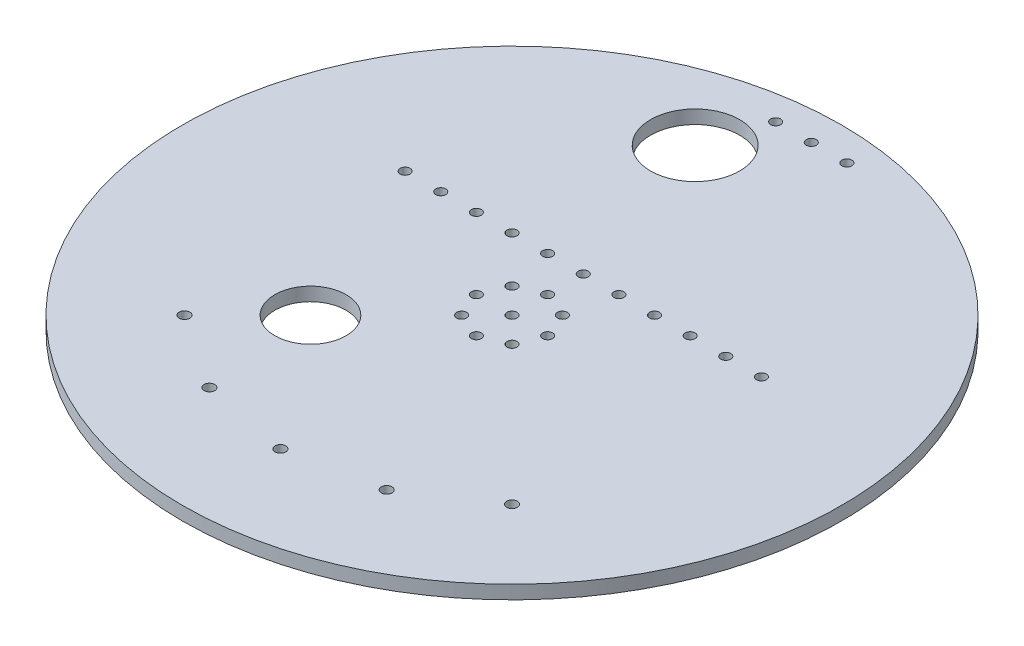
ISO-10303-21;
HEADER;
FILE_DESCRIPTION(('STEP AP214'),'2;1');
FILE_NAME('part.step','',(''),(''),'','','');
FILE_SCHEMA(('AUTOMOTIVE_DESIGN { 1 0 10303 214 1 1 1 1 }'));
ENDSEC;
DATA;
#1=APPLICATION_CONTEXT('core data for automotive mechanical design processes');
#2=APPLICATION_PROTOCOL_DEFINITION('international standard','automotive_design',2000,#1);
#3=PRODUCT_CONTEXT('',#1,'mechanical');
#4=PRODUCT('Part','Part','',(#3));
#5=PRODUCT_RELATED_PRODUCT_CATEGORY('part','',(#4));
#6=PRODUCT_DEFINITION_FORMATION('','',#4);
#7=PRODUCT_DEFINITION_CONTEXT('part definition',#1,'design');
#8=PRODUCT_DEFINITION('design','',#6,#7);
#9=PRODUCT_DEFINITION_SHAPE('','',#8);
#10=(LENGTH_UNIT() NAMED_UNIT(*) SI_UNIT(.MILLI.,.METRE.));
#11=(NAMED_UNIT(*) PLANE_ANGLE_UNIT() SI_UNIT($,.RADIAN.));
#12=(NAMED_UNIT(*) SI_UNIT($,.STERADIAN.) SOLID_ANGLE_UNIT());
#13=UNCERTAINTY_MEASURE_WITH_UNIT(LENGTH_MEASURE(1.E-05),#10,'distance_accuracy_value','');
#14=(GEOMETRIC_REPRESENTATION_CONTEXT(3) GLOBAL_UNCERTAINTY_ASSIGNED_CONTEXT((#13)) GLOBAL_UNIT_ASSIGNED_CONTEXT((#10,
#11,#12)) REPRESENTATION_CONTEXT('',''));
#15=CARTESIAN_POINT('',(0.,0.,0.));
#16=DIRECTION('',(0.,0.,1.));
#17=DIRECTION('',(1.,0.,0.));
#18=AXIS2_PLACEMENT_3D('',#15,#16,#17);
#19=CARTESIAN_POINT('',(0.,-4.826,0.));
#20=DIRECTION('',(0.,1.,0.));
#21=DIRECTION('',(0.,0.,1.));
#22=AXIS2_PLACEMENT_3D('',#19,#20,#21);
#23=CYLINDRICAL_SURFACE('',#22,117.475);
#24=CARTESIAN_POINT('',(0.,-4.826,0.));
#25=DIRECTION('',(0.,1.,0.));
#26=DIRECTION('',(0.,0.,1.));
#27=AXIS2_PLACEMENT_3D('',#24,#25,#26);
#28=CIRCLE('',#27,117.475);
#29=CARTESIAN_POINT('',(0.,-4.826,117.475));
#30=VERTEX_POINT('',#29);
#31=EDGE_CURVE('E10',#30,#30,#28,.T.);
#32=ORIENTED_EDGE('',*,*,#31,.T.);
#33=EDGE_LOOP('',(#32));
#34=FACE_BOUND('',#33,.T.);
#35=CARTESIAN_POINT('',(0.,0.,0.));
#36=DIRECTION('',(0.,1.,0.));
#37=DIRECTION('',(0.,0.,1.));
#38=AXIS2_PLACEMENT_3D('',#35,#36,#37);
#39=CIRCLE('',#38,117.475);
#40=CARTESIAN_POINT('',(0.,0.,117.475));
#41=VERTEX_POINT('',#40);
#42=EDGE_CURVE('E34',#41,#41,#39,.T.);
#43=ORIENTED_EDGE('',*,*,#42,.F.);
#44=EDGE_LOOP('',(#43));
#45=FACE_BOUND('',#44,.T.);
#46=ADVANCED_FACE('F31',(#34,#45),#23,.T.);
#47=CARTESIAN_POINT('',(0.,-4.826,0.));
#48=DIRECTION('',(0.,1.,0.));
#49=DIRECTION('',(0.,0.,1.));
#50=AXIS2_PLACEMENT_3D('',#47,#48,#49);
#51=PLANE('',#50);
#52=CARTESIAN_POINT('',(-19.812,-4.826,-85.09));
#53=DIRECTION('',(0.,1.,0.));
#54=DIRECTION('',(0.,0.,1.));
#55=AXIS2_PLACEMENT_3D('',#52,#53,#54);
#56=CIRCLE('',#55,15.875);
#57=CARTESIAN_POINT('',(-19.812,-4.826,-69.215));
#58=VERTEX_POINT('',#57);
#59=EDGE_CURVE('E214',#58,#58,#56,.T.);
#60=ORIENTED_EDGE('',*,*,#59,.T.);
#61=EDGE_LOOP('',(#60));
#62=FACE_BOUND('',#61,.T.);
#63=CARTESIAN_POINT('',(-58.3716647869496,-4.826,58.3716647869494));
#64=DIRECTION('',(0.,1.,0.));
#65=DIRECTION('',(-0.707106781186549,0.,0.707106781186546));
#66=AXIS2_PLACEMENT_3D('',#63,#64,#65);
#67=CIRCLE('',#66,1.90500000000001);
#68=CARTESIAN_POINT('',(-59.71870320511,-4.826,59.7187032051098));
#69=VERTEX_POINT('',#68);
#70=EDGE_CURVE('E208',#69,#69,#67,.T.);
#71=ORIENTED_EDGE('',*,*,#70,.T.);
#72=EDGE_LOOP('',(#71));
#73=FACE_BOUND('',#72,.T.);
#74=CARTESIAN_POINT('',(-31.5905173417382,-4.826,76.2662554088067));
#75=DIRECTION('',(0.,1.,0.));
#76=DIRECTION('',(-0.382683432365091,0.,0.923879532511287));
#77=AXIS2_PLACEMENT_3D('',#74,#75,#76);
#78=CIRCLE('',#77,1.90500000000001);
#79=CARTESIAN_POINT('',(-32.3195292803937,-4.826,78.0262459182407));
#80=VERTEX_POINT('',#79);
#81=EDGE_CURVE('E202',#80,#80,#78,.T.);
#82=ORIENTED_EDGE('',*,*,#81,.T.);
#83=EDGE_LOOP('',(#82));
#84=FACE_BOUND('',#83,.T.);
#85=CARTESIAN_POINT('',(58.3716647869496,-4.826,58.3716647869494));
#86=DIRECTION('',(0.,1.,0.));
#87=DIRECTION('',(0.707106781186549,0.,0.707106781186546));
#88=AXIS2_PLACEMENT_3D('',#85,#86,#87);
#89=CIRCLE('',#88,1.90500000000001);
#90=CARTESIAN_POINT('',(59.71870320511,-4.826,59.7187032051098));
#91=VERTEX_POINT('',#90);
#92=EDGE_CURVE('E196',#91,#91,#89,.T.);
#93=ORIENTED_EDGE('',*,*,#92,.T.);
#94=EDGE_LOOP('',(#93));
#95=FACE_BOUND('',#94,.T.);
#96=CARTESIAN_POINT('',(31.5905173417382,-4.826,76.2662554088067));
#97=DIRECTION('',(0.,1.,0.));
#98=DIRECTION('',(0.382683432365091,0.,0.923879532511287));
#99=AXIS2_PLACEMENT_3D('',#96,#97,#98);
#100=CIRCLE('',#99,1.90500000000001);
#101=CARTESIAN_POINT('',(32.3195292803937,-4.826,78.0262459182407));
#102=VERTEX_POINT('',#101);
#103=EDGE_CURVE('E190',#102,#102,#100,.T.);
#104=ORIENTED_EDGE('',*,*,#103,.T.);
#105=EDGE_LOOP('',(#104));
#106=FACE_BOUND('',#105,.T.);
#107=CARTESIAN_POINT('',(0.,-4.826,82.55));
#108=DIRECTION('',(0.,1.,0.));
#109=DIRECTION('',(0.,0.,1.));
#110=AXIS2_PLACEMENT_3D('',#107,#108,#109);
#111=CIRCLE('',#110,1.90500000000001);
#112=CARTESIAN_POINT('',(0.,-4.826,84.455));
#113=VERTEX_POINT('',#112);
#114=EDGE_CURVE('E184',#113,#113,#111,.T.);
#115=ORIENTED_EDGE('',*,*,#114,.T.);
#116=EDGE_LOOP('',(#115));
#117=FACE_BOUND('',#116,.T.);
#118=CARTESIAN_POINT('',(-35.9210244842764,-4.826,35.9210244842768));
#119=DIRECTION('',(0.,1.,0.));
#120=DIRECTION('',(0.,0.,1.));
#121=AXIS2_PLACEMENT_3D('',#118,#119,#120);
#122=CIRCLE('',#121,12.7);
#123=CARTESIAN_POINT('',(-35.9210244842764,-4.826,48.6210244842768));
#124=VERTEX_POINT('',#123);
#125=EDGE_CURVE('E178',#124,#124,#122,.T.);
#126=ORIENTED_EDGE('',*,*,#125,.T.);
#127=EDGE_LOOP('',(#126));
#128=FACE_BOUND('',#127,.T.);
#129=CARTESIAN_POINT('',(-8.98025612106917,-4.826,8.98025612106914));
#130=DIRECTION('',(0.,1.,0.));
#131=DIRECTION('',(0.,0.,1.));
#132=AXIS2_PLACEMENT_3D('',#129,#130,#131);
#133=CIRCLE('',#132,1.778);
#134=CARTESIAN_POINT('',(-8.98025612106917,-4.826,10.7582561210691));
#135=VERTEX_POINT('',#134);
#136=EDGE_CURVE('E172',#135,#135,#133,.T.);
#137=ORIENTED_EDGE('',*,*,#136,.T.);
#138=EDGE_LOOP('',(#137));
#139=FACE_BOUND('',#138,.T.);
#140=CARTESIAN_POINT('',(8.98025612106914,-4.826,8.98025612106917));
#141=DIRECTION('',(0.,1.,0.));
#142=DIRECTION('',(0.,0.,1.));
#143=AXIS2_PLACEMENT_3D('',#140,#141,#142);
#144=CIRCLE('',#143,1.778);
#145=CARTESIAN_POINT('',(8.98025612106914,-4.826,10.7582561210692));
#146=VERTEX_POINT('',#145);
#147=EDGE_CURVE('E166',#146,#146,#144,.T.);
#148=ORIENTED_EDGE('',*,*,#147,.T.);
#149=EDGE_LOOP('',(#148));
#150=FACE_BOUND('',#149,.T.);
#151=CARTESIAN_POINT('',(8.98025612106917,-4.826,-8.98025612106913));
#152=DIRECTION('',(0.,1.,0.));
#153=DIRECTION('',(0.,0.,1.));
#154=AXIS2_PLACEMENT_3D('',#151,#152,#153);
#155=CIRCLE('',#154,1.778);
#156=CARTESIAN_POINT('',(8.98025612106917,-4.826,-7.20225612106913));
#157=VERTEX_POINT('',#156);
#158=EDGE_CURVE('E160',#157,#157,#155,.T.);
#159=ORIENTED_EDGE('',*,*,#158,.T.);
#160=EDGE_LOOP('',(#159));
#161=FACE_BOUND('',#160,.T.);
#162=CARTESIAN_POINT('',(-8.98025612106914,-4.826,-8.98025612106917));
#163=DIRECTION('',(0.,1.,0.));
#164=DIRECTION('',(0.,0.,1.));
#165=AXIS2_PLACEMENT_3D('',#162,#163,#164);
#166=CIRCLE('',#165,1.778);
#167=CARTESIAN_POINT('',(-8.98025612106914,-4.826,-7.20225612106917));
#168=VERTEX_POINT('',#167);
#169=EDGE_CURVE('E154',#168,#168,#166,.T.);
#170=ORIENTED_EDGE('',*,*,#169,.T.);
#171=EDGE_LOOP('',(#170));
#172=FACE_BOUND('',#171,.T.);
#173=CARTESIAN_POINT('',(-12.7,-4.826,0.));
#174=DIRECTION('',(0.,1.,0.));
#175=DIRECTION('',(0.,0.,1.));
#176=AXIS2_PLACEMENT_3D('',#173,#174,#175);
#177=CIRCLE('',#176,1.778);
#178=CARTESIAN_POINT('',(-12.7,-4.826,1.778));
#179=VERTEX_POINT('',#178);
#180=EDGE_CURVE('E148',#179,#179,#177,.T.);
#181=ORIENTED_EDGE('',*,*,#180,.T.);
#182=EDGE_LOOP('',(#181));
#183=FACE_BOUND('',#182,.T.);
#184=CARTESIAN_POINT('',(0.,-4.826,12.7));
#185=DIRECTION('',(0.,1.,0.));
#186=DIRECTION('',(0.,0.,1.));
#187=AXIS2_PLACEMENT_3D('',#184,#185,#186);
#188=CIRCLE('',#187,1.778);
#189=CARTESIAN_POINT('',(0.,-4.826,14.478));
#190=VERTEX_POINT('',#189);
#191=EDGE_CURVE('E142',#190,#190,#188,.T.);
#192=ORIENTED_EDGE('',*,*,#191,.T.);
#193=EDGE_LOOP('',(#192));
#194=FACE_BOUND('',#193,.T.);
#195=CARTESIAN_POINT('',(12.7,-4.826,0.));
#196=DIRECTION('',(0.,1.,0.));
#197=DIRECTION('',(0.,0.,1.));
#198=AXIS2_PLACEMENT_3D('',#195,#196,#197);
#199=CIRCLE('',#198,1.778);
#200=CARTESIAN_POINT('',(12.7,-4.826,1.778));
#201=VERTEX_POINT('',#200);
#202=EDGE_CURVE('E136',#201,#201,#199,.T.);
#203=ORIENTED_EDGE('',*,*,#202,.T.);
#204=EDGE_LOOP('',(#203));
#205=FACE_BOUND('',#204,.T.);
#206=CARTESIAN_POINT('',(0.,-4.826,-12.7));
#207=DIRECTION('',(0.,1.,0.));
#208=DIRECTION('',(0.,0.,1.));
#209=AXIS2_PLACEMENT_3D('',#206,#207,#208);
#210=CIRCLE('',#209,1.778);
#211=CARTESIAN_POINT('',(0.,-4.826,-10.922));
#212=VERTEX_POINT('',#211);
#213=EDGE_CURVE('E130',#212,#212,#210,.T.);
#214=ORIENTED_EDGE('',*,*,#213,.T.);
#215=EDGE_LOOP('',(#214));
#216=FACE_BOUND('',#215,.T.);
#217=CARTESIAN_POINT('',(12.7,-4.826,-106.68));
#218=DIRECTION('',(0.,1.,0.));
#219=DIRECTION('',(0.,0.,1.));
#220=AXIS2_PLACEMENT_3D('',#217,#218,#219);
#221=CIRCLE('',#220,1.77799999999999);
#222=CARTESIAN_POINT('',(12.7,-4.826,-104.902));
#223=VERTEX_POINT('',#222);
#224=EDGE_CURVE('E124',#223,#223,#221,.T.);
#225=ORIENTED_EDGE('',*,*,#224,.T.);
#226=EDGE_LOOP('',(#225));
#227=FACE_BOUND('',#226,.T.);
#228=CARTESIAN_POINT('',(-12.7,-4.826,-106.68));
#229=DIRECTION('',(0.,1.,0.));
#230=DIRECTION('',(0.,0.,1.));
#231=AXIS2_PLACEMENT_3D('',#228,#229,#230);
#232=CIRCLE('',#231,1.77799999999999);
#233=CARTESIAN_POINT('',(-12.7,-4.826,-104.902));
#234=VERTEX_POINT('',#233);
#235=EDGE_CURVE('E118',#234,#234,#232,.T.);
#236=ORIENTED_EDGE('',*,*,#235,.T.);
#237=EDGE_LOOP('',(#236));
#238=FACE_BOUND('',#237,.T.);
#239=CARTESIAN_POINT('',(0.,-4.826,-106.68));
#240=DIRECTION('',(0.,1.,0.));
#241=DIRECTION('',(0.,0.,1.));
#242=AXIS2_PLACEMENT_3D('',#239,#240,#241);
#243=CIRCLE('',#242,1.77799999999999);
#244=CARTESIAN_POINT('',(0.,-4.826,-104.902));
#245=VERTEX_POINT('',#244);
#246=EDGE_CURVE('E112',#245,#245,#243,.T.);
#247=ORIENTED_EDGE('',*,*,#246,.T.);
#248=EDGE_LOOP('',(#247));
#249=FACE_BOUND('',#248,.T.);
#250=CARTESIAN_POINT('',(63.5,-4.826,-25.4));
#251=DIRECTION('',(0.,1.,0.));
#252=DIRECTION('',(0.,0.,1.));
#253=AXIS2_PLACEMENT_3D('',#250,#251,#252);
#254=CIRCLE('',#253,1.77800000000001);
#255=CARTESIAN_POINT('',(63.5,-4.826,-23.622));
#256=VERTEX_POINT('',#255);
#257=EDGE_CURVE('E106',#256,#256,#254,.T.);
#258=ORIENTED_EDGE('',*,*,#257,.T.);
#259=EDGE_LOOP('',(#258));
#260=FACE_BOUND('',#259,.T.);
#261=CARTESIAN_POINT('',(-63.5,-4.826,-25.4));
#262=DIRECTION('',(0.,1.,0.));
#263=DIRECTION('',(0.,0.,1.));
#264=AXIS2_PLACEMENT_3D('',#261,#262,#263);
#265=CIRCLE('',#264,1.778);
#266=CARTESIAN_POINT('',(-63.5,-4.826,-23.622));
#267=VERTEX_POINT('',#266);
#268=EDGE_CURVE('E100',#267,#267,#265,.T.);
#269=ORIENTED_EDGE('',*,*,#268,.T.);
#270=EDGE_LOOP('',(#269));
#271=FACE_BOUND('',#270,.T.);
#272=CARTESIAN_POINT('',(38.1,-4.826,-25.4));
#273=DIRECTION('',(0.,1.,0.));
#274=DIRECTION('',(0.,0.,1.));
#275=AXIS2_PLACEMENT_3D('',#272,#273,#274);
#276=CIRCLE('',#275,1.778);
#277=CARTESIAN_POINT('',(38.1,-4.826,-23.622));
#278=VERTEX_POINT('',#277);
#279=EDGE_CURVE('E94',#278,#278,#276,.T.);
#280=ORIENTED_EDGE('',*,*,#279,.T.);
#281=EDGE_LOOP('',(#280));
#282=FACE_BOUND('',#281,.T.);
#283=CARTESIAN_POINT('',(25.4,-4.826,-25.4));
#284=DIRECTION('',(0.,1.,0.));
#285=DIRECTION('',(0.,0.,1.));
#286=AXIS2_PLACEMENT_3D('',#283,#284,#285);
#287=CIRCLE('',#286,1.778);
#288=CARTESIAN_POINT('',(25.4,-4.826,-23.622));
#289=VERTEX_POINT('',#288);
#290=EDGE_CURVE('E88',#289,#289,#287,.T.);
#291=ORIENTED_EDGE('',*,*,#290,.T.);
#292=EDGE_LOOP('',(#291));
#293=FACE_BOUND('',#292,.T.);
#294=CARTESIAN_POINT('',(12.7,-4.826,-25.4));
#295=DIRECTION('',(0.,1.,0.));
#296=DIRECTION('',(0.,0.,1.));
#297=AXIS2_PLACEMENT_3D('',#294,#295,#296);
#298=CIRCLE('',#297,1.778);
#299=CARTESIAN_POINT('',(12.7,-4.826,-23.622));
#300=VERTEX_POINT('',#299);
#301=EDGE_CURVE('E82',#300,#300,#298,.T.);
#302=ORIENTED_EDGE('',*,*,#301,.T.);
#303=EDGE_LOOP('',(#302));
#304=FACE_BOUND('',#303,.T.);
#305=CARTESIAN_POINT('',(-38.1,-4.826,-25.4));
#306=DIRECTION('',(0.,1.,0.));
#307=DIRECTION('',(0.,0.,1.));
#308=AXIS2_PLACEMENT_3D('',#305,#306,#307);
#309=CIRCLE('',#308,1.778);
#310=CARTESIAN_POINT('',(-38.1,-4.826,-23.622));
#311=VERTEX_POINT('',#310);
#312=EDGE_CURVE('E76',#311,#311,#309,.T.);
#313=ORIENTED_EDGE('',*,*,#312,.T.);
#314=EDGE_LOOP('',(#313));
#315=FACE_BOUND('',#314,.T.);
#316=CARTESIAN_POINT('',(-25.4,-4.826,-25.4));
#317=DIRECTION('',(0.,1.,0.));
#318=DIRECTION('',(0.,0.,1.));
#319=AXIS2_PLACEMENT_3D('',#316,#317,#318);
#320=CIRCLE('',#319,1.778);
#321=CARTESIAN_POINT('',(-25.4,-4.826,-23.622));
#322=VERTEX_POINT('',#321);
#323=EDGE_CURVE('E70',#322,#322,#320,.T.);
#324=ORIENTED_EDGE('',*,*,#323,.T.);
#325=EDGE_LOOP('',(#324));
#326=FACE_BOUND('',#325,.T.);
#327=CARTESIAN_POINT('',(50.8,-4.826,-25.4));
#328=DIRECTION('',(0.,1.,0.));
#329=DIRECTION('',(0.,0.,1.));
#330=AXIS2_PLACEMENT_3D('',#327,#328,#329);
#331=CIRCLE('',#330,1.778);
#332=CARTESIAN_POINT('',(50.8,-4.826,-23.622));
#333=VERTEX_POINT('',#332);
#334=EDGE_CURVE('E64',#333,#333,#331,.T.);
#335=ORIENTED_EDGE('',*,*,#334,.T.);
#336=EDGE_LOOP('',(#335));
#337=FACE_BOUND('',#336,.T.);
#338=CARTESIAN_POINT('',(-50.8,-4.826,-25.4));
#339=DIRECTION('',(0.,1.,0.));
#340=DIRECTION('',(0.,0.,1.));
#341=AXIS2_PLACEMENT_3D('',#338,#339,#340);
#342=CIRCLE('',#341,1.778);
#343=CARTESIAN_POINT('',(-50.8,-4.826,-23.622));
#344=VERTEX_POINT('',#343);
#345=EDGE_CURVE('E58',#344,#344,#342,.T.);
#346=ORIENTED_EDGE('',*,*,#345,.T.);
#347=EDGE_LOOP('',(#346));
#348=FACE_BOUND('',#347,.T.);
#349=CARTESIAN_POINT('',(-12.7,-4.826,-25.4));
#350=DIRECTION('',(0.,1.,0.));
#351=DIRECTION('',(0.,0.,1.));
#352=AXIS2_PLACEMENT_3D('',#349,#350,#351);
#353=CIRCLE('',#352,1.778);
#354=CARTESIAN_POINT('',(-12.7,-4.826,-23.622));
#355=VERTEX_POINT('',#354);
#356=EDGE_CURVE('E52',#355,#355,#353,.T.);
#357=ORIENTED_EDGE('',*,*,#356,.T.);
#358=EDGE_LOOP('',(#357));
#359=FACE_BOUND('',#358,.T.);
#360=CARTESIAN_POINT('',(0.,-4.826,-25.4));
#361=DIRECTION('',(0.,1.,0.));
#362=DIRECTION('',(0.,0.,1.));
#363=AXIS2_PLACEMENT_3D('',#360,#361,#362);
#364=CIRCLE('',#363,1.778);
#365=CARTESIAN_POINT('',(0.,-4.826,-23.622));
#366=VERTEX_POINT('',#365);
#367=EDGE_CURVE('E46',#366,#366,#364,.T.);
#368=ORIENTED_EDGE('',*,*,#367,.T.);
#369=EDGE_LOOP('',(#368));
#370=FACE_BOUND('',#369,.T.);
#371=CARTESIAN_POINT('',(0.,-4.826,0.));
#372=DIRECTION('',(0.,1.,0.));
#373=DIRECTION('',(0.,0.,1.));
#374=AXIS2_PLACEMENT_3D('',#371,#372,#373);
#375=CIRCLE('',#374,1.778);
#376=CARTESIAN_POINT('',(0.,-4.826,1.778));
#377=VERTEX_POINT('',#376);
#378=EDGE_CURVE('E41',#377,#377,#375,.T.);
#379=ORIENTED_EDGE('',*,*,#378,.T.);
#380=EDGE_LOOP('',(#379));
#381=FACE_BOUND('',#380,.T.);
#382=ORIENTED_EDGE('',*,*,#31,.F.);
#383=EDGE_LOOP('',(#382));
#384=FACE_BOUND('',#383,.T.);
#385=ADVANCED_FACE('F223',(#62,#73,#84,#95,#106,#117,#128,#139,#150,#161,#172,#183,#194,#205,
#216,#227,#238,#249,#260,#271,#282,#293,#304,#315,#326,#337,#348,#359,#370,#381,#384),#51,.F.);
#386=CARTESIAN_POINT('',(0.,0.,0.));
#387=DIRECTION('',(0.,1.,0.));
#388=DIRECTION('',(0.,0.,1.));
#389=AXIS2_PLACEMENT_3D('',#386,#387,#388);
#390=PLANE('',#389);
#391=CARTESIAN_POINT('',(-19.812,0.,-85.09));
#392=DIRECTION('',(0.,1.,0.));
#393=DIRECTION('',(0.,0.,1.));
#394=AXIS2_PLACEMENT_3D('',#391,#392,#393);
#395=CIRCLE('',#394,15.875);
#396=CARTESIAN_POINT('',(-19.812,0.,-69.215));
#397=VERTEX_POINT('',#396);
#398=EDGE_CURVE('E217',#397,#397,#395,.T.);
#399=ORIENTED_EDGE('',*,*,#398,.F.);
#400=EDGE_LOOP('',(#399));
#401=FACE_BOUND('',#400,.T.);
#402=CARTESIAN_POINT('',(-58.3716647869496,0.,58.3716647869494));
#403=DIRECTION('',(0.,1.,0.));
#404=DIRECTION('',(-0.707106781186549,0.,0.707106781186546));
#405=AXIS2_PLACEMENT_3D('',#402,#403,#404);
#406=CIRCLE('',#405,1.90500000000001);
#407=CARTESIAN_POINT('',(-59.71870320511,0.,59.7187032051098));
#408=VERTEX_POINT('',#407);
#409=EDGE_CURVE('E211',#408,#408,#406,.T.);
#410=ORIENTED_EDGE('',*,*,#409,.F.);
#411=EDGE_LOOP('',(#410));
#412=FACE_BOUND('',#411,.T.);
#413=CARTESIAN_POINT('',(-31.5905173417382,0.,76.2662554088067));
#414=DIRECTION('',(0.,1.,0.));
#415=DIRECTION('',(-0.382683432365091,0.,0.923879532511287));
#416=AXIS2_PLACEMENT_3D('',#413,#414,#415);
#417=CIRCLE('',#416,1.90500000000001);
#418=CARTESIAN_POINT('',(-32.3195292803937,0.,78.0262459182407));
#419=VERTEX_POINT('',#418);
#420=EDGE_CURVE('E205',#419,#419,#417,.T.);
#421=ORIENTED_EDGE('',*,*,#420,.F.);
#422=EDGE_LOOP('',(#421));
#423=FACE_BOUND('',#422,.T.);
#424=CARTESIAN_POINT('',(58.3716647869496,0.,58.3716647869494));
#425=DIRECTION('',(0.,1.,0.));
#426=DIRECTION('',(0.707106781186549,0.,0.707106781186546));
#427=AXIS2_PLACEMENT_3D('',#424,#425,#426);
#428=CIRCLE('',#427,1.90500000000001);
#429=CARTESIAN_POINT('',(59.71870320511,0.,59.7187032051098));
#430=VERTEX_POINT('',#429);
#431=EDGE_CURVE('E199',#430,#430,#428,.T.);
#432=ORIENTED_EDGE('',*,*,#431,.F.);
#433=EDGE_LOOP('',(#432));
#434=FACE_BOUND('',#433,.T.);
#435=CARTESIAN_POINT('',(31.5905173417382,0.,76.2662554088067));
#436=DIRECTION('',(0.,1.,0.));
#437=DIRECTION('',(0.382683432365091,0.,0.923879532511287));
#438=AXIS2_PLACEMENT_3D('',#435,#436,#437);
#439=CIRCLE('',#438,1.90500000000001);
#440=CARTESIAN_POINT('',(32.3195292803937,0.,78.0262459182407));
#441=VERTEX_POINT('',#440);
#442=EDGE_CURVE('E193',#441,#441,#439,.T.);
#443=ORIENTED_EDGE('',*,*,#442,.F.);
#444=EDGE_LOOP('',(#443));
#445=FACE_BOUND('',#444,.T.);
#446=CARTESIAN_POINT('',(0.,0.,82.55));
#447=DIRECTION('',(0.,1.,0.));
#448=DIRECTION('',(0.,0.,1.));
#449=AXIS2_PLACEMENT_3D('',#446,#447,#448);
#450=CIRCLE('',#449,1.90500000000001);
#451=CARTESIAN_POINT('',(0.,0.,84.455));
#452=VERTEX_POINT('',#451);
#453=EDGE_CURVE('E187',#452,#452,#450,.T.);
#454=ORIENTED_EDGE('',*,*,#453,.F.);
#455=EDGE_LOOP('',(#454));
#456=FACE_BOUND('',#455,.T.);
#457=CARTESIAN_POINT('',(-35.9210244842764,0.,35.9210244842768));
#458=DIRECTION('',(0.,1.,0.));
#459=DIRECTION('',(0.,0.,1.));
#460=AXIS2_PLACEMENT_3D('',#457,#458,#459);
#461=CIRCLE('',#460,12.7);
#462=CARTESIAN_POINT('',(-35.9210244842764,0.,48.6210244842768));
#463=VERTEX_POINT('',#462);
#464=EDGE_CURVE('E181',#463,#463,#461,.T.);
#465=ORIENTED_EDGE('',*,*,#464,.F.);
#466=EDGE_LOOP('',(#465));
#467=FACE_BOUND('',#466,.T.);
#468=CARTESIAN_POINT('',(-8.98025612106917,0.,8.98025612106914));
#469=DIRECTION('',(0.,1.,0.));
#470=DIRECTION('',(0.,0.,1.));
#471=AXIS2_PLACEMENT_3D('',#468,#469,#470);
#472=CIRCLE('',#471,1.778);
#473=CARTESIAN_POINT('',(-8.98025612106917,0.,10.7582561210691));
#474=VERTEX_POINT('',#473);
#475=EDGE_CURVE('E175',#474,#474,#472,.T.);
#476=ORIENTED_EDGE('',*,*,#475,.F.);
#477=EDGE_LOOP('',(#476));
#478=FACE_BOUND('',#477,.T.);
#479=CARTESIAN_POINT('',(8.98025612106914,0.,8.98025612106917));
#480=DIRECTION('',(0.,1.,0.));
#481=DIRECTION('',(0.,0.,1.));
#482=AXIS2_PLACEMENT_3D('',#479,#480,#481);
#483=CIRCLE('',#482,1.778);
#484=CARTESIAN_POINT('',(8.98025612106914,0.,10.7582561210692));
#485=VERTEX_POINT('',#484);
#486=EDGE_CURVE('E169',#485,#485,#483,.T.);
#487=ORIENTED_EDGE('',*,*,#486,.F.);
#488=EDGE_LOOP('',(#487));
#489=FACE_BOUND('',#488,.T.);
#490=CARTESIAN_POINT('',(8.98025612106917,0.,-8.98025612106913));
#491=DIRECTION('',(0.,1.,0.));
#492=DIRECTION('',(0.,0.,1.));
#493=AXIS2_PLACEMENT_3D('',#490,#491,#492);
#494=CIRCLE('',#493,1.778);
#495=CARTESIAN_POINT('',(8.98025612106917,0.,-7.20225612106913));
#496=VERTEX_POINT('',#495);
#497=EDGE_CURVE('E163',#496,#496,#494,.T.);
#498=ORIENTED_EDGE('',*,*,#497,.F.);
#499=EDGE_LOOP('',(#498));
#500=FACE_BOUND('',#499,.T.);
#501=CARTESIAN_POINT('',(-8.98025612106914,0.,-8.98025612106917));
#502=DIRECTION('',(0.,1.,0.));
#503=DIRECTION('',(0.,0.,1.));
#504=AXIS2_PLACEMENT_3D('',#501,#502,#503);
#505=CIRCLE('',#504,1.778);
#506=CARTESIAN_POINT('',(-8.98025612106914,0.,-7.20225612106917));
#507=VERTEX_POINT('',#506);
#508=EDGE_CURVE('E157',#507,#507,#505,.T.);
#509=ORIENTED_EDGE('',*,*,#508,.F.);
#510=EDGE_LOOP('',(#509));
#511=FACE_BOUND('',#510,.T.);
#512=CARTESIAN_POINT('',(-12.7,0.,0.));
#513=DIRECTION('',(0.,1.,0.));
#514=DIRECTION('',(0.,0.,1.));
#515=AXIS2_PLACEMENT_3D('',#512,#513,#514);
#516=CIRCLE('',#515,1.778);
#517=CARTESIAN_POINT('',(-12.7,0.,1.778));
#518=VERTEX_POINT('',#517);
#519=EDGE_CURVE('E151',#518,#518,#516,.T.);
#520=ORIENTED_EDGE('',*,*,#519,.F.);
#521=EDGE_LOOP('',(#520));
#522=FACE_BOUND('',#521,.T.);
#523=CARTESIAN_POINT('',(0.,0.,12.7));
#524=DIRECTION('',(0.,1.,0.));
#525=DIRECTION('',(0.,0.,1.));
#526=AXIS2_PLACEMENT_3D('',#523,#524,#525);
#527=CIRCLE('',#526,1.778);
#528=CARTESIAN_POINT('',(0.,0.,14.478));
#529=VERTEX_POINT('',#528);
#530=EDGE_CURVE('E145',#529,#529,#527,.T.);
#531=ORIENTED_EDGE('',*,*,#530,.F.);
#532=EDGE_LOOP('',(#531));
#533=FACE_BOUND('',#532,.T.);
#534=CARTESIAN_POINT('',(12.7,0.,0.));
#535=DIRECTION('',(0.,1.,0.));
#536=DIRECTION('',(0.,0.,1.));
#537=AXIS2_PLACEMENT_3D('',#534,#535,#536);
#538=CIRCLE('',#537,1.778);
#539=CARTESIAN_POINT('',(12.7,0.,1.778));
#540=VERTEX_POINT('',#539);
#541=EDGE_CURVE('E139',#540,#540,#538,.T.);
#542=ORIENTED_EDGE('',*,*,#541,.F.);
#543=EDGE_LOOP('',(#542));
#544=FACE_BOUND('',#543,.T.);
#545=CARTESIAN_POINT('',(0.,0.,-12.7));
#546=DIRECTION('',(0.,1.,0.));
#547=DIRECTION('',(0.,0.,1.));
#548=AXIS2_PLACEMENT_3D('',#545,#546,#547);
#549=CIRCLE('',#548,1.778);
#550=CARTESIAN_POINT('',(0.,0.,-10.922));
#551=VERTEX_POINT('',#550);
#552=EDGE_CURVE('E133',#551,#551,#549,.T.);
#553=ORIENTED_EDGE('',*,*,#552,.F.);
#554=EDGE_LOOP('',(#553));
#555=FACE_BOUND('',#554,.T.);
#556=CARTESIAN_POINT('',(12.7,0.,-106.68));
#557=DIRECTION('',(0.,1.,0.));
#558=DIRECTION('',(0.,0.,1.));
#559=AXIS2_PLACEMENT_3D('',#556,#557,#558);
#560=CIRCLE('',#559,1.77799999999999);
#561=CARTESIAN_POINT('',(12.7,0.,-104.902));
#562=VERTEX_POINT('',#561);
#563=EDGE_CURVE('E127',#562,#562,#560,.T.);
#564=ORIENTED_EDGE('',*,*,#563,.F.);
#565=EDGE_LOOP('',(#564));
#566=FACE_BOUND('',#565,.T.);
#567=CARTESIAN_POINT('',(-12.7,0.,-106.68));
#568=DIRECTION('',(0.,1.,0.));
#569=DIRECTION('',(0.,0.,1.));
#570=AXIS2_PLACEMENT_3D('',#567,#568,#569);
#571=CIRCLE('',#570,1.77799999999999);
#572=CARTESIAN_POINT('',(-12.7,0.,-104.902));
#573=VERTEX_POINT('',#572);
#574=EDGE_CURVE('E121',#573,#573,#571,.T.);
#575=ORIENTED_EDGE('',*,*,#574,.F.);
#576=EDGE_LOOP('',(#575));
#577=FACE_BOUND('',#576,.T.);
#578=CARTESIAN_POINT('',(0.,0.,-106.68));
#579=DIRECTION('',(0.,1.,0.));
#580=DIRECTION('',(0.,0.,1.));
#581=AXIS2_PLACEMENT_3D('',#578,#579,#580);
#582=CIRCLE('',#581,1.77799999999999);
#583=CARTESIAN_POINT('',(0.,0.,-104.902));
#584=VERTEX_POINT('',#583);
#585=EDGE_CURVE('E115',#584,#584,#582,.T.);
#586=ORIENTED_EDGE('',*,*,#585,.F.);
#587=EDGE_LOOP('',(#586));
#588=FACE_BOUND('',#587,.T.);
#589=CARTESIAN_POINT('',(63.5,0.,-25.4));
#590=DIRECTION('',(0.,1.,0.));
#591=DIRECTION('',(0.,0.,1.));
#592=AXIS2_PLACEMENT_3D('',#589,#590,#591);
#593=CIRCLE('',#592,1.77800000000001);
#594=CARTESIAN_POINT('',(63.5,0.,-23.622));
#595=VERTEX_POINT('',#594);
#596=EDGE_CURVE('E109',#595,#595,#593,.T.);
#597=ORIENTED_EDGE('',*,*,#596,.F.);
#598=EDGE_LOOP('',(#597));
#599=FACE_BOUND('',#598,.T.);
#600=CARTESIAN_POINT('',(-63.5,0.,-25.4));
#601=DIRECTION('',(0.,1.,0.));
#602=DIRECTION('',(0.,0.,1.));
#603=AXIS2_PLACEMENT_3D('',#600,#601,#602);
#604=CIRCLE('',#603,1.778);
#605=CARTESIAN_POINT('',(-63.5,0.,-23.622));
#606=VERTEX_POINT('',#605);
#607=EDGE_CURVE('E103',#606,#606,#604,.T.);
#608=ORIENTED_EDGE('',*,*,#607,.F.);
#609=EDGE_LOOP('',(#608));
#610=FACE_BOUND('',#609,.T.);
#611=CARTESIAN_POINT('',(38.1,0.,-25.4));
#612=DIRECTION('',(0.,1.,0.));
#613=DIRECTION('',(0.,0.,1.));
#614=AXIS2_PLACEMENT_3D('',#611,#612,#613);
#615=CIRCLE('',#614,1.778);
#616=CARTESIAN_POINT('',(38.1,0.,-23.622));
#617=VERTEX_POINT('',#616);
#618=EDGE_CURVE('E97',#617,#617,#615,.T.);
#619=ORIENTED_EDGE('',*,*,#618,.F.);
#620=EDGE_LOOP('',(#619));
#621=FACE_BOUND('',#620,.T.);
#622=CARTESIAN_POINT('',(25.4,0.,-25.4));
#623=DIRECTION('',(0.,1.,0.));
#624=DIRECTION('',(0.,0.,1.));
#625=AXIS2_PLACEMENT_3D('',#622,#623,#624);
#626=CIRCLE('',#625,1.778);
#627=CARTESIAN_POINT('',(25.4,0.,-23.622));
#628=VERTEX_POINT('',#627);
#629=EDGE_CURVE('E91',#628,#628,#626,.T.);
#630=ORIENTED_EDGE('',*,*,#629,.F.);
#631=EDGE_LOOP('',(#630));
#632=FACE_BOUND('',#631,.T.);
#633=CARTESIAN_POINT('',(12.7,0.,-25.4));
#634=DIRECTION('',(0.,1.,0.));
#635=DIRECTION('',(0.,0.,1.));
#636=AXIS2_PLACEMENT_3D('',#633,#634,#635);
#637=CIRCLE('',#636,1.778);
#638=CARTESIAN_POINT('',(12.7,0.,-23.622));
#639=VERTEX_POINT('',#638);
#640=EDGE_CURVE('E85',#639,#639,#637,.T.);
#641=ORIENTED_EDGE('',*,*,#640,.F.);
#642=EDGE_LOOP('',(#641));
#643=FACE_BOUND('',#642,.T.);
#644=CARTESIAN_POINT('',(-38.1,0.,-25.4));
#645=DIRECTION('',(0.,1.,0.));
#646=DIRECTION('',(0.,0.,1.));
#647=AXIS2_PLACEMENT_3D('',#644,#645,#646);
#648=CIRCLE('',#647,1.778);
#649=CARTESIAN_POINT('',(-38.1,0.,-23.622));
#650=VERTEX_POINT('',#649);
#651=EDGE_CURVE('E79',#650,#650,#648,.T.);
#652=ORIENTED_EDGE('',*,*,#651,.F.);
#653=EDGE_LOOP('',(#652));
#654=FACE_BOUND('',#653,.T.);
#655=CARTESIAN_POINT('',(-25.4,0.,-25.4));
#656=DIRECTION('',(0.,1.,0.));
#657=DIRECTION('',(0.,0.,1.));
#658=AXIS2_PLACEMENT_3D('',#655,#656,#657);
#659=CIRCLE('',#658,1.778);
#660=CARTESIAN_POINT('',(-25.4,0.,-23.622));
#661=VERTEX_POINT('',#660);
#662=EDGE_CURVE('E73',#661,#661,#659,.T.);
#663=ORIENTED_EDGE('',*,*,#662,.F.);
#664=EDGE_LOOP('',(#663));
#665=FACE_BOUND('',#664,.T.);
#666=CARTESIAN_POINT('',(50.8,0.,-25.4));
#667=DIRECTION('',(0.,1.,0.));
#668=DIRECTION('',(0.,0.,1.));
#669=AXIS2_PLACEMENT_3D('',#666,#667,#668);
#670=CIRCLE('',#669,1.778);
#671=CARTESIAN_POINT('',(50.8,0.,-23.622));
#672=VERTEX_POINT('',#671);
#673=EDGE_CURVE('E67',#672,#672,#670,.T.);
#674=ORIENTED_EDGE('',*,*,#673,.F.);
#675=EDGE_LOOP('',(#674));
#676=FACE_BOUND('',#675,.T.);
#677=CARTESIAN_POINT('',(-50.8,0.,-25.4));
#678=DIRECTION('',(0.,1.,0.));
#679=DIRECTION('',(0.,0.,1.));
#680=AXIS2_PLACEMENT_3D('',#677,#678,#679);
#681=CIRCLE('',#680,1.778);
#682=CARTESIAN_POINT('',(-50.8,0.,-23.622));
#683=VERTEX_POINT('',#682);
#684=EDGE_CURVE('E61',#683,#683,#681,.T.);
#685=ORIENTED_EDGE('',*,*,#684,.F.);
#686=EDGE_LOOP('',(#685));
#687=FACE_BOUND('',#686,.T.);
#688=CARTESIAN_POINT('',(-12.7,0.,-25.4));
#689=DIRECTION('',(0.,1.,0.));
#690=DIRECTION('',(0.,0.,1.));
#691=AXIS2_PLACEMENT_3D('',#688,#689,#690);
#692=CIRCLE('',#691,1.778);
#693=CARTESIAN_POINT('',(-12.7,0.,-23.622));
#694=VERTEX_POINT('',#693);
#695=EDGE_CURVE('E55',#694,#694,#692,.T.);
#696=ORIENTED_EDGE('',*,*,#695,.F.);
#697=EDGE_LOOP('',(#696));
#698=FACE_BOUND('',#697,.T.);
#699=CARTESIAN_POINT('',(0.,0.,-25.4));
#700=DIRECTION('',(0.,1.,0.));
#701=DIRECTION('',(0.,0.,1.));
#702=AXIS2_PLACEMENT_3D('',#699,#700,#701);
#703=CIRCLE('',#702,1.778);
#704=CARTESIAN_POINT('',(0.,0.,-23.622));
#705=VERTEX_POINT('',#704);
#706=EDGE_CURVE('E49',#705,#705,#703,.T.);
#707=ORIENTED_EDGE('',*,*,#706,.F.);
#708=EDGE_LOOP('',(#707));
#709=FACE_BOUND('',#708,.T.);
#710=CARTESIAN_POINT('',(0.,0.,0.));
#711=DIRECTION('',(0.,1.,0.));
#712=DIRECTION('',(0.,0.,1.));
#713=AXIS2_PLACEMENT_3D('',#710,#711,#712);
#714=CIRCLE('',#713,1.778);
#715=CARTESIAN_POINT('',(0.,0.,1.778));
#716=VERTEX_POINT('',#715);
#717=EDGE_CURVE('E43',#716,#716,#714,.T.);
#718=ORIENTED_EDGE('',*,*,#717,.F.);
#719=EDGE_LOOP('',(#718));
#720=FACE_BOUND('',#719,.T.);
#721=ORIENTED_EDGE('',*,*,#42,.T.);
#722=EDGE_LOOP('',(#721));
#723=FACE_BOUND('',#722,.T.);
#724=ADVANCED_FACE('F233',(#401,#412,#423,#434,#445,#456,#467,#478,#489,#500,#511,#522,#533,
#544,#555,#566,#577,#588,#599,#610,#621,#632,#643,#654,#665,#676,#687,#698,#709,#720,#723),#390,.T.);
#725=CARTESIAN_POINT('',(0.,-4.826,0.));
#726=DIRECTION('',(0.,1.,0.));
#727=DIRECTION('',(0.,0.,1.));
#728=AXIS2_PLACEMENT_3D('',#725,#726,#727);
#729=CYLINDRICAL_SURFACE('',#728,1.778);
#730=ORIENTED_EDGE('',*,*,#378,.F.);
#731=EDGE_LOOP('',(#730));
#732=FACE_BOUND('',#731,.T.);
#733=ORIENTED_EDGE('',*,*,#717,.T.);
#734=EDGE_LOOP('',(#733));
#735=FACE_BOUND('',#734,.T.);
#736=ADVANCED_FACE('F236',(#732,#735),#729,.F.);
#737=CARTESIAN_POINT('',(0.,-4.826,-25.4));
#738=DIRECTION('',(0.,1.,0.));
#739=DIRECTION('',(0.,0.,1.));
#740=AXIS2_PLACEMENT_3D('',#737,#738,#739);
#741=CYLINDRICAL_SURFACE('',#740,1.778);
#742=ORIENTED_EDGE('',*,*,#367,.F.);
#743=EDGE_LOOP('',(#742));
#744=FACE_BOUND('',#743,.T.);
#745=ORIENTED_EDGE('',*,*,#706,.T.);
#746=EDGE_LOOP('',(#745));
#747=FACE_BOUND('',#746,.T.);
#748=ADVANCED_FACE('F307',(#744,#747),#741,.F.);
#749=CARTESIAN_POINT('',(-12.7,-4.826,-25.4));
#750=DIRECTION('',(0.,1.,0.));
#751=DIRECTION('',(0.,0.,1.));
#752=AXIS2_PLACEMENT_3D('',#749,#750,#751);
#753=CYLINDRICAL_SURFACE('',#752,1.778);
#754=ORIENTED_EDGE('',*,*,#356,.F.);
#755=EDGE_LOOP('',(#754));
#756=FACE_BOUND('',#755,.T.);
#757=ORIENTED_EDGE('',*,*,#695,.T.);
#758=EDGE_LOOP('',(#757));
#759=FACE_BOUND('',#758,.T.);
#760=ADVANCED_FACE('F311',(#756,#759),#753,.F.);
#761=CARTESIAN_POINT('',(-50.8,-4.826,-25.4));
#762=DIRECTION('',(0.,1.,0.));
#763=DIRECTION('',(0.,0.,1.));
#764=AXIS2_PLACEMENT_3D('',#761,#762,#763);
#765=CYLINDRICAL_SURFACE('',#764,1.778);
#766=ORIENTED_EDGE('',*,*,#345,.F.);
#767=EDGE_LOOP('',(#766));
#768=FACE_BOUND('',#767,.T.);
#769=ORIENTED_EDGE('',*,*,#684,.T.);
#770=EDGE_LOOP('',(#769));
#771=FACE_BOUND('',#770,.T.);
#772=ADVANCED_FACE('F315',(#768,#771),#765,.F.);
#773=CARTESIAN_POINT('',(50.8,-4.826,-25.4));
#774=DIRECTION('',(0.,1.,0.));
#775=DIRECTION('',(0.,0.,1.));
#776=AXIS2_PLACEMENT_3D('',#773,#774,#775);
#777=CYLINDRICAL_SURFACE('',#776,1.778);
#778=ORIENTED_EDGE('',*,*,#334,.F.);
#779=EDGE_LOOP('',(#778));
#780=FACE_BOUND('',#779,.T.);
#781=ORIENTED_EDGE('',*,*,#673,.T.);
#782=EDGE_LOOP('',(#781));
#783=FACE_BOUND('',#782,.T.);
#784=ADVANCED_FACE('F319',(#780,#783),#777,.F.);
#785=CARTESIAN_POINT('',(-25.4,-4.826,-25.4));
#786=DIRECTION('',(0.,1.,0.));
#787=DIRECTION('',(0.,0.,1.));
#788=AXIS2_PLACEMENT_3D('',#785,#786,#787);
#789=CYLINDRICAL_SURFACE('',#788,1.778);
#790=ORIENTED_EDGE('',*,*,#323,.F.);
#791=EDGE_LOOP('',(#790));
#792=FACE_BOUND('',#791,.T.);
#793=ORIENTED_EDGE('',*,*,#662,.T.);
#794=EDGE_LOOP('',(#793));
#795=FACE_BOUND('',#794,.T.);
#796=ADVANCED_FACE('F323',(#792,#795),#789,.F.);
#797=CARTESIAN_POINT('',(-38.1,-4.826,-25.4));
#798=DIRECTION('',(0.,1.,0.));
#799=DIRECTION('',(0.,0.,1.));
#800=AXIS2_PLACEMENT_3D('',#797,#798,#799);
#801=CYLINDRICAL_SURFACE('',#800,1.778);
#802=ORIENTED_EDGE('',*,*,#312,.F.);
#803=EDGE_LOOP('',(#802));
#804=FACE_BOUND('',#803,.T.);
#805=ORIENTED_EDGE('',*,*,#651,.T.);
#806=EDGE_LOOP('',(#805));
#807=FACE_BOUND('',#806,.T.);
#808=ADVANCED_FACE('F327',(#804,#807),#801,.F.);
#809=CARTESIAN_POINT('',(12.7,-4.826,-25.4));
#810=DIRECTION('',(0.,1.,0.));
#811=DIRECTION('',(0.,0.,1.));
#812=AXIS2_PLACEMENT_3D('',#809,#810,#811);
#813=CYLINDRICAL_SURFACE('',#812,1.778);
#814=ORIENTED_EDGE('',*,*,#301,.F.);
#815=EDGE_LOOP('',(#814));
#816=FACE_BOUND('',#815,.T.);
#817=ORIENTED_EDGE('',*,*,#640,.T.);
#818=EDGE_LOOP('',(#817));
#819=FACE_BOUND('',#818,.T.);
#820=ADVANCED_FACE('F331',(#816,#819),#813,.F.);
#821=CARTESIAN_POINT('',(25.4,-4.826,-25.4));
#822=DIRECTION('',(0.,1.,0.));
#823=DIRECTION('',(0.,0.,1.));
#824=AXIS2_PLACEMENT_3D('',#821,#822,#823);
#825=CYLINDRICAL_SURFACE('',#824,1.778);
#826=ORIENTED_EDGE('',*,*,#290,.F.);
#827=EDGE_LOOP('',(#826));
#828=FACE_BOUND('',#827,.T.);
#829=ORIENTED_EDGE('',*,*,#629,.T.);
#830=EDGE_LOOP('',(#829));
#831=FACE_BOUND('',#830,.T.);
#832=ADVANCED_FACE('F335',(#828,#831),#825,.F.);
#833=CARTESIAN_POINT('',(38.1,-4.826,-25.4));
#834=DIRECTION('',(0.,1.,0.));
#835=DIRECTION('',(0.,0.,1.));
#836=AXIS2_PLACEMENT_3D('',#833,#834,#835);
#837=CYLINDRICAL_SURFACE('',#836,1.778);
#838=ORIENTED_EDGE('',*,*,#279,.F.);
#839=EDGE_LOOP('',(#838));
#840=FACE_BOUND('',#839,.T.);
#841=ORIENTED_EDGE('',*,*,#618,.T.);
#842=EDGE_LOOP('',(#841));
#843=FACE_BOUND('',#842,.T.);
#844=ADVANCED_FACE('F339',(#840,#843),#837,.F.);
#845=CARTESIAN_POINT('',(-63.5,-4.826,-25.4));
#846=DIRECTION('',(0.,1.,0.));
#847=DIRECTION('',(0.,0.,1.));
#848=AXIS2_PLACEMENT_3D('',#845,#846,#847);
#849=CYLINDRICAL_SURFACE('',#848,1.778);
#850=ORIENTED_EDGE('',*,*,#268,.F.);
#851=EDGE_LOOP('',(#850));
#852=FACE_BOUND('',#851,.T.);
#853=ORIENTED_EDGE('',*,*,#607,.T.);
#854=EDGE_LOOP('',(#853));
#855=FACE_BOUND('',#854,.T.);
#856=ADVANCED_FACE('F343',(#852,#855),#849,.F.);
#857=CARTESIAN_POINT('',(63.5,-4.826,-25.4));
#858=DIRECTION('',(0.,1.,0.));
#859=DIRECTION('',(0.,0.,1.));
#860=AXIS2_PLACEMENT_3D('',#857,#858,#859);
#861=CYLINDRICAL_SURFACE('',#860,1.77800000000001);
#862=ORIENTED_EDGE('',*,*,#257,.F.);
#863=EDGE_LOOP('',(#862));
#864=FACE_BOUND('',#863,.T.);
#865=ORIENTED_EDGE('',*,*,#596,.T.);
#866=EDGE_LOOP('',(#865));
#867=FACE_BOUND('',#866,.T.);
#868=ADVANCED_FACE('F347',(#864,#867),#861,.F.);
#869=CARTESIAN_POINT('',(0.,-4.826,-106.68));
#870=DIRECTION('',(0.,1.,0.));
#871=DIRECTION('',(0.,0.,1.));
#872=AXIS2_PLACEMENT_3D('',#869,#870,#871);
#873=CYLINDRICAL_SURFACE('',#872,1.77799999999999);
#874=ORIENTED_EDGE('',*,*,#246,.F.);
#875=EDGE_LOOP('',(#874));
#876=FACE_BOUND('',#875,.T.);
#877=ORIENTED_EDGE('',*,*,#585,.T.);
#878=EDGE_LOOP('',(#877));
#879=FACE_BOUND('',#878,.T.);
#880=ADVANCED_FACE('F351',(#876,#879),#873,.F.);
#881=CARTESIAN_POINT('',(-12.7,-4.826,-106.68));
#882=DIRECTION('',(0.,1.,0.));
#883=DIRECTION('',(0.,0.,1.));
#884=AXIS2_PLACEMENT_3D('',#881,#882,#883);
#885=CYLINDRICAL_SURFACE('',#884,1.77799999999999);
#886=ORIENTED_EDGE('',*,*,#235,.F.);
#887=EDGE_LOOP('',(#886));
#888=FACE_BOUND('',#887,.T.);
#889=ORIENTED_EDGE('',*,*,#574,.T.);
#890=EDGE_LOOP('',(#889));
#891=FACE_BOUND('',#890,.T.);
#892=ADVANCED_FACE('F355',(#888,#891),#885,.F.);
#893=CARTESIAN_POINT('',(12.7,-4.826,-106.68));
#894=DIRECTION('',(0.,1.,0.));
#895=DIRECTION('',(0.,0.,1.));
#896=AXIS2_PLACEMENT_3D('',#893,#894,#895);
#897=CYLINDRICAL_SURFACE('',#896,1.77799999999999);
#898=ORIENTED_EDGE('',*,*,#224,.F.);
#899=EDGE_LOOP('',(#898));
#900=FACE_BOUND('',#899,.T.);
#901=ORIENTED_EDGE('',*,*,#563,.T.);
#902=EDGE_LOOP('',(#901));
#903=FACE_BOUND('',#902,.T.);
#904=ADVANCED_FACE('F359',(#900,#903),#897,.F.);
#905=CARTESIAN_POINT('',(0.,-4.826,-12.7));
#906=DIRECTION('',(0.,1.,0.));
#907=DIRECTION('',(0.,0.,1.));
#908=AXIS2_PLACEMENT_3D('',#905,#906,#907);
#909=CYLINDRICAL_SURFACE('',#908,1.778);
#910=ORIENTED_EDGE('',*,*,#213,.F.);
#911=EDGE_LOOP('',(#910));
#912=FACE_BOUND('',#911,.T.);
#913=ORIENTED_EDGE('',*,*,#552,.T.);
#914=EDGE_LOOP('',(#913));
#915=FACE_BOUND('',#914,.T.);
#916=ADVANCED_FACE('F363',(#912,#915),#909,.F.);
#917=CARTESIAN_POINT('',(12.7,-4.826,0.));
#918=DIRECTION('',(0.,1.,0.));
#919=DIRECTION('',(0.,0.,1.));
#920=AXIS2_PLACEMENT_3D('',#917,#918,#919);
#921=CYLINDRICAL_SURFACE('',#920,1.778);
#922=ORIENTED_EDGE('',*,*,#202,.F.);
#923=EDGE_LOOP('',(#922));
#924=FACE_BOUND('',#923,.T.);
#925=ORIENTED_EDGE('',*,*,#541,.T.);
#926=EDGE_LOOP('',(#925));
#927=FACE_BOUND('',#926,.T.);
#928=ADVANCED_FACE('F367',(#924,#927),#921,.F.);
#929=CARTESIAN_POINT('',(0.,-4.826,12.7));
#930=DIRECTION('',(0.,1.,0.));
#931=DIRECTION('',(0.,0.,1.));
#932=AXIS2_PLACEMENT_3D('',#929,#930,#931);
#933=CYLINDRICAL_SURFACE('',#932,1.778);
#934=ORIENTED_EDGE('',*,*,#191,.F.);
#935=EDGE_LOOP('',(#934));
#936=FACE_BOUND('',#935,.T.);
#937=ORIENTED_EDGE('',*,*,#530,.T.);
#938=EDGE_LOOP('',(#937));
#939=FACE_BOUND('',#938,.T.);
#940=ADVANCED_FACE('F371',(#936,#939),#933,.F.);
#941=CARTESIAN_POINT('',(-12.7,-4.826,0.));
#942=DIRECTION('',(0.,1.,0.));
#943=DIRECTION('',(0.,0.,1.));
#944=AXIS2_PLACEMENT_3D('',#941,#942,#943);
#945=CYLINDRICAL_SURFACE('',#944,1.778);
#946=ORIENTED_EDGE('',*,*,#180,.F.);
#947=EDGE_LOOP('',(#946));
#948=FACE_BOUND('',#947,.T.);
#949=ORIENTED_EDGE('',*,*,#519,.T.);
#950=EDGE_LOOP('',(#949));
#951=FACE_BOUND('',#950,.T.);
#952=ADVANCED_FACE('F375',(#948,#951),#945,.F.);
#953=CARTESIAN_POINT('',(-8.98025612106914,-4.826,-8.98025612106917));
#954=DIRECTION('',(0.,1.,0.));
#955=DIRECTION('',(0.,0.,1.));
#956=AXIS2_PLACEMENT_3D('',#953,#954,#955);
#957=CYLINDRICAL_SURFACE('',#956,1.778);
#958=ORIENTED_EDGE('',*,*,#169,.F.);
#959=EDGE_LOOP('',(#958));
#960=FACE_BOUND('',#959,.T.);
#961=ORIENTED_EDGE('',*,*,#508,.T.);
#962=EDGE_LOOP('',(#961));
#963=FACE_BOUND('',#962,.T.);
#964=ADVANCED_FACE('F379',(#960,#963),#957,.F.);
#965=CARTESIAN_POINT('',(8.98025612106917,-4.826,-8.98025612106913));
#966=DIRECTION('',(0.,1.,0.));
#967=DIRECTION('',(0.,0.,1.));
#968=AXIS2_PLACEMENT_3D('',#965,#966,#967);
#969=CYLINDRICAL_SURFACE('',#968,1.778);
#970=ORIENTED_EDGE('',*,*,#158,.F.);
#971=EDGE_LOOP('',(#970));
#972=FACE_BOUND('',#971,.T.);
#973=ORIENTED_EDGE('',*,*,#497,.T.);
#974=EDGE_LOOP('',(#973));
#975=FACE_BOUND('',#974,.T.);
#976=ADVANCED_FACE('F383',(#972,#975),#969,.F.);
#977=CARTESIAN_POINT('',(8.98025612106914,-4.826,8.98025612106917));
#978=DIRECTION('',(0.,1.,0.));
#979=DIRECTION('',(0.,0.,1.));
#980=AXIS2_PLACEMENT_3D('',#977,#978,#979);
#981=CYLINDRICAL_SURFACE('',#980,1.778);
#982=ORIENTED_EDGE('',*,*,#147,.F.);
#983=EDGE_LOOP('',(#982));
#984=FACE_BOUND('',#983,.T.);
#985=ORIENTED_EDGE('',*,*,#486,.T.);
#986=EDGE_LOOP('',(#985));
#987=FACE_BOUND('',#986,.T.);
#988=ADVANCED_FACE('F387',(#984,#987),#981,.F.);
#989=CARTESIAN_POINT('',(-8.98025612106917,-4.826,8.98025612106914));
#990=DIRECTION('',(0.,1.,0.));
#991=DIRECTION('',(0.,0.,1.));
#992=AXIS2_PLACEMENT_3D('',#989,#990,#991);
#993=CYLINDRICAL_SURFACE('',#992,1.778);
#994=ORIENTED_EDGE('',*,*,#136,.F.);
#995=EDGE_LOOP('',(#994));
#996=FACE_BOUND('',#995,.T.);
#997=ORIENTED_EDGE('',*,*,#475,.T.);
#998=EDGE_LOOP('',(#997));
#999=FACE_BOUND('',#998,.T.);
#1000=ADVANCED_FACE('F391',(#996,#999),#993,.F.);
#1001=CARTESIAN_POINT('',(-35.9210244842764,-4.826,35.9210244842768));
#1002=DIRECTION('',(0.,1.,0.));
#1003=DIRECTION('',(0.,0.,1.));
#1004=AXIS2_PLACEMENT_3D('',#1001,#1002,#1003);
#1005=CYLINDRICAL_SURFACE('',#1004,12.7);
#1006=ORIENTED_EDGE('',*,*,#125,.F.);
#1007=EDGE_LOOP('',(#1006));
#1008=FACE_BOUND('',#1007,.T.);
#1009=ORIENTED_EDGE('',*,*,#464,.T.);
#1010=EDGE_LOOP('',(#1009));
#1011=FACE_BOUND('',#1010,.T.);
#1012=ADVANCED_FACE('F395',(#1008,#1011),#1005,.F.);
#1013=CARTESIAN_POINT('',(0.,-4.826,82.55));
#1014=DIRECTION('',(0.,1.,0.));
#1015=DIRECTION('',(0.,0.,1.));
#1016=AXIS2_PLACEMENT_3D('',#1013,#1014,#1015);
#1017=CYLINDRICAL_SURFACE('',#1016,1.90500000000001);
#1018=ORIENTED_EDGE('',*,*,#114,.F.);
#1019=EDGE_LOOP('',(#1018));
#1020=FACE_BOUND('',#1019,.T.);
#1021=ORIENTED_EDGE('',*,*,#453,.T.);
#1022=EDGE_LOOP('',(#1021));
#1023=FACE_BOUND('',#1022,.T.);
#1024=ADVANCED_FACE('F399',(#1020,#1023),#1017,.F.);
#1025=CARTESIAN_POINT('',(31.5905173417382,-4.826,76.2662554088067));
#1026=DIRECTION('',(0.,1.,0.));
#1027=DIRECTION('',(0.,0.,1.));
#1028=AXIS2_PLACEMENT_3D('',#1025,#1026,#1027);
#1029=CYLINDRICAL_SURFACE('',#1028,1.90500000000001);
#1030=ORIENTED_EDGE('',*,*,#103,.F.);
#1031=EDGE_LOOP('',(#1030));
#1032=FACE_BOUND('',#1031,.T.);
#1033=ORIENTED_EDGE('',*,*,#442,.T.);
#1034=EDGE_LOOP('',(#1033));
#1035=FACE_BOUND('',#1034,.T.);
#1036=ADVANCED_FACE('F403',(#1032,#1035),#1029,.F.);
#1037=CARTESIAN_POINT('',(58.3716647869496,-4.826,58.3716647869494));
#1038=DIRECTION('',(0.,1.,0.));
#1039=DIRECTION('',(0.,0.,1.));
#1040=AXIS2_PLACEMENT_3D('',#1037,#1038,#1039);
#1041=CYLINDRICAL_SURFACE('',#1040,1.90500000000001);
#1042=ORIENTED_EDGE('',*,*,#92,.F.);
#1043=EDGE_LOOP('',(#1042));
#1044=FACE_BOUND('',#1043,.T.);
#1045=ORIENTED_EDGE('',*,*,#431,.T.);
#1046=EDGE_LOOP('',(#1045));
#1047=FACE_BOUND('',#1046,.T.);
#1048=ADVANCED_FACE('F407',(#1044,#1047),#1041,.F.);
#1049=CARTESIAN_POINT('',(-31.5905173417382,-4.826,76.2662554088067));
#1050=DIRECTION('',(0.,1.,0.));
#1051=DIRECTION('',(0.,0.,1.));
#1052=AXIS2_PLACEMENT_3D('',#1049,#1050,#1051);
#1053=CYLINDRICAL_SURFACE('',#1052,1.90500000000001);
#1054=ORIENTED_EDGE('',*,*,#81,.F.);
#1055=EDGE_LOOP('',(#1054));
#1056=FACE_BOUND('',#1055,.T.);
#1057=ORIENTED_EDGE('',*,*,#420,.T.);
#1058=EDGE_LOOP('',(#1057));
#1059=FACE_BOUND('',#1058,.T.);
#1060=ADVANCED_FACE('F411',(#1056,#1059),#1053,.F.);
#1061=CARTESIAN_POINT('',(-58.3716647869496,-4.826,58.3716647869494));
#1062=DIRECTION('',(0.,1.,0.));
#1063=DIRECTION('',(0.,0.,1.));
#1064=AXIS2_PLACEMENT_3D('',#1061,#1062,#1063);
#1065=CYLINDRICAL_SURFACE('',#1064,1.90500000000001);
#1066=ORIENTED_EDGE('',*,*,#70,.F.);
#1067=EDGE_LOOP('',(#1066));
#1068=FACE_BOUND('',#1067,.T.);
#1069=ORIENTED_EDGE('',*,*,#409,.T.);
#1070=EDGE_LOOP('',(#1069));
#1071=FACE_BOUND('',#1070,.T.);
#1072=ADVANCED_FACE('F229',(#1068,#1071),#1065,.F.);
#1073=CARTESIAN_POINT('',(-19.812,-4.826,-85.09));
#1074=DIRECTION('',(0.,1.,0.));
#1075=DIRECTION('',(0.,0.,1.));
#1076=AXIS2_PLACEMENT_3D('',#1073,#1074,#1075);
#1077=CYLINDRICAL_SURFACE('',#1076,15.875);
#1078=ORIENTED_EDGE('',*,*,#59,.F.);
#1079=EDGE_LOOP('',(#1078));
#1080=FACE_BOUND('',#1079,.T.);
#1081=ORIENTED_EDGE('',*,*,#398,.T.);
#1082=EDGE_LOOP('',(#1081));
#1083=FACE_BOUND('',#1082,.T.);
#1084=ADVANCED_FACE('F226',(#1080,#1083),#1077,.F.);
#1085=CLOSED_SHELL('',(#46,#385,#724,#736,#748,#760,#772,#784,#796,#808,#820,#832,#844,#856,
#868,#880,#892,#904,#916,#928,#940,#952,#964,#976,#988,#1000,#1012,#1024,#1036,#1048,#1060,
#1072,#1084));
#1086=MANIFOLD_SOLID_BREP('B2',#1085);
#1087=ADVANCED_BREP_SHAPE_REPRESENTATION('',(#18,#1086),#14);
#1088=SHAPE_DEFINITION_REPRESENTATION(#9,#1087);
ENDSEC;
END-ISO-10303-21;
